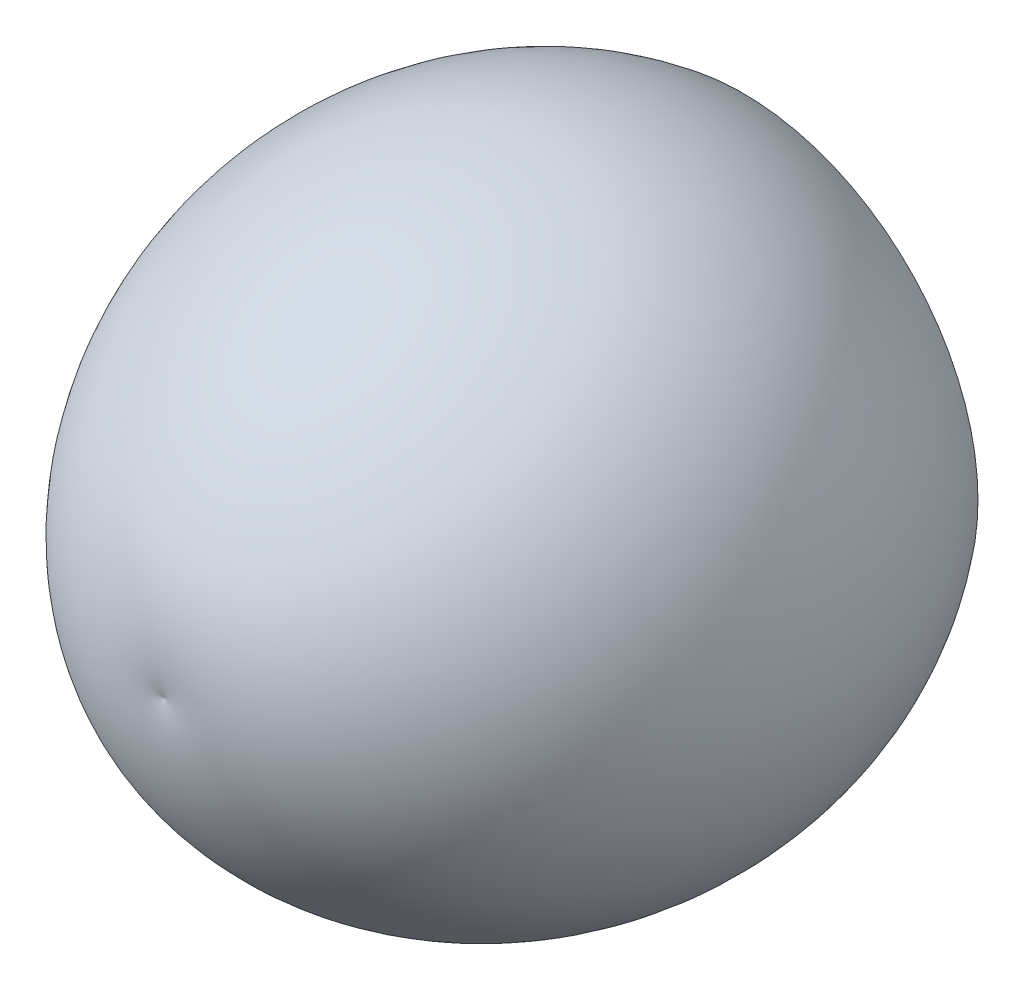
ISO-10303-21;
HEADER;
FILE_DESCRIPTION(('STEP AP214'),'2;1');
FILE_NAME('part.step','',(''),(''),'','','');
FILE_SCHEMA(('AUTOMOTIVE_DESIGN { 1 0 10303 214 1 1 1 1 }'));
ENDSEC;
DATA;
#1=APPLICATION_CONTEXT('core data for automotive mechanical design processes');
#2=APPLICATION_PROTOCOL_DEFINITION('international standard','automotive_design',2000,#1);
#3=PRODUCT_CONTEXT('',#1,'mechanical');
#4=PRODUCT('Part','Part','',(#3));
#5=PRODUCT_RELATED_PRODUCT_CATEGORY('part','',(#4));
#6=PRODUCT_DEFINITION_FORMATION('','',#4);
#7=PRODUCT_DEFINITION_CONTEXT('part definition',#1,'design');
#8=PRODUCT_DEFINITION('design','',#6,#7);
#9=PRODUCT_DEFINITION_SHAPE('','',#8);
#10=(LENGTH_UNIT() NAMED_UNIT(*) SI_UNIT(.MILLI.,.METRE.));
#11=(NAMED_UNIT(*) PLANE_ANGLE_UNIT() SI_UNIT($,.RADIAN.));
#12=(NAMED_UNIT(*) SI_UNIT($,.STERADIAN.) SOLID_ANGLE_UNIT());
#13=UNCERTAINTY_MEASURE_WITH_UNIT(LENGTH_MEASURE(1.E-05),#10,'distance_accuracy_value','');
#14=(GEOMETRIC_REPRESENTATION_CONTEXT(3) GLOBAL_UNCERTAINTY_ASSIGNED_CONTEXT((#13)) GLOBAL_UNIT_ASSIGNED_CONTEXT((#10,
#11,#12)) REPRESENTATION_CONTEXT('',''));
#15=CARTESIAN_POINT('',(0.,0.,0.));
#16=DIRECTION('',(0.,0.,1.));
#17=DIRECTION('',(1.,0.,0.));
#18=AXIS2_PLACEMENT_3D('',#15,#16,#17);
#19=CARTESIAN_POINT('',(0.,0.,0.));
#20=CARTESIAN_POINT('',(0.043830976130994,0.,0.0186791363310697));
#21=CARTESIAN_POINT('',(0.131974543979919,0.,0.0548378624464019));
#22=CARTESIAN_POINT('',(0.31022763523346,0.,0.122268555270368));
#23=CARTESIAN_POINT('',(0.670407337037751,0.,0.246977058198205));
#24=CARTESIAN_POINT('',(1.17142801003007,0.,0.400964352623035));
#25=CARTESIAN_POINT('',(1.81561581344275,0.,0.574205655000247));
#26=CARTESIAN_POINT('',(2.75085990380028,0.,0.7924162138733));
#27=CARTESIAN_POINT('',(3.8882458320896,0.,1.0127469204612));
#28=CARTESIAN_POINT('',(5.22919551712919,0.,1.21839888894545));
#29=CARTESIAN_POINT('',(6.77394931813752,0.,1.39284942327746));
#30=CARTESIAN_POINT('',(8.72532477994025,0.,1.54457831731911));
#31=CARTESIAN_POINT('',(11.0842847706564,0.,1.6281822498997));
#32=CARTESIAN_POINT('',(13.6441193424084,0.,1.60015484439841));
#33=CARTESIAN_POINT('',(16.398680633937,0.,1.44637657097625));
#34=CARTESIAN_POINT('',(19.5281539189791,0.,1.1548953203217));
#35=CARTESIAN_POINT('',(23.0243882545599,0.,0.682393983639629));
#36=CARTESIAN_POINT('',(27.0730604900188,0.,-0.0615872578854551));
#37=CARTESIAN_POINT('',(32.7936771558061,0.,-1.4223647519291));
#38=CARTESIAN_POINT('',(39.5430024310636,0.,-3.49089860816371));
#39=CARTESIAN_POINT('',(47.2245291139392,0.,-6.46735147429374));
#40=CARTESIAN_POINT('',(57.5562927937646,0.,-11.4363848691124));
#41=CARTESIAN_POINT('',(69.4027369692584,0.,-18.5710285506906));
#42=CARTESIAN_POINT('',(82.2967202987623,0.,-28.3725054942802));
#43=CARTESIAN_POINT('',(95.6199182335728,0.,-41.2795774666161));
#44=CARTESIAN_POINT('',(107.563224066596,0.,-55.8609472479338));
#45=CARTESIAN_POINT('',(117.827965423516,0.,-71.6658797242835));
#46=CARTESIAN_POINT('',(126.341324726231,0.,-88.4773133468858));
#47=CARTESIAN_POINT('',(133.036982051647,0.,-106.090936874956));
#48=CARTESIAN_POINT('',(137.252240905113,0.,-122.030733415426));
#49=CARTESIAN_POINT('',(139.657409359358,0.,-135.946181249383));
#50=CARTESIAN_POINT('',(140.841675986377,0.,-147.647372298136));
#51=CARTESIAN_POINT('',(141.291720366522,0.,-157.045426617269));
#52=CARTESIAN_POINT('',(141.233130837806,0.,-167.630271044416));
#53=CARTESIAN_POINT('',(140.42987636832,0.,-179.367359109796));
#54=CARTESIAN_POINT('',(138.941593194893,0.,-189.854188373775));
#55=CARTESIAN_POINT('',(137.020196404185,0.,-199.065653138572));
#56=CARTESIAN_POINT('',(135.258491664991,0.,-205.896350548171));
#57=CARTESIAN_POINT('',(133.955832387977,0.,-210.415164030316));
#58=CARTESIAN_POINT('',(132.5251616505,0.,-214.895091140581));
#59=CARTESIAN_POINT('',(130.966717722194,0.,-219.332220248478));
#60=CARTESIAN_POINT('',(129.280902335316,0.,-223.722506087244));
#61=CARTESIAN_POINT('',(127.69471036426,0.,-227.519557360189));
#62=CARTESIAN_POINT('',(126.256215149428,0.,-230.739744237555));
#63=CARTESIAN_POINT('',(124.754699009714,0.,-233.931037787412));
#64=CARTESIAN_POINT('',(123.451366323489,0.,-236.565139378214));
#65=CARTESIAN_POINT('',(122.095661560921,0.,-239.173327922019));
#66=CARTESIAN_POINT('',(120.407390083382,0.,-242.269136840017));
#67=CARTESIAN_POINT('',(118.656323389429,0.,-245.331912569755));
#68=CARTESIAN_POINT('',(116.830397080705,0.,-248.347471588187));
#69=CARTESIAN_POINT('',(114.925598842458,0.,-251.319153061921));
#70=CARTESIAN_POINT('',(113.292165698358,0.,-253.757347639572));
#71=CARTESIAN_POINT('',(112.115819327361,0.,-255.454750297579));
#72=CARTESIAN_POINT('',(111.101943834626,0.,-256.880227693953));
#73=CARTESIAN_POINT('',(110.202837030668,0.,-258.114214128868));
#74=CARTESIAN_POINT('',(109.493385846108,0.,-259.075677100228));
#75=CARTESIAN_POINT('',(108.670260494782,0.,-260.164838088381));
#76=CARTESIAN_POINT('',(107.969459905131,0.,-261.083221772819));
#77=CARTESIAN_POINT('',(107.245854497313,0.,-262.007379494795));
#78=CARTESIAN_POINT('',(106.881328516675,0.,-262.469058983019));
#79=CARTESIAN_POINT('',(106.696233767227,0.,-262.701929072325));
#80=B_SPLINE_CURVE_WITH_KNOTS('',4,(#19,#20,#21,#22,#23,#24,#25,#26,#27,#28,#29,#30,#31,#32,#33,
#34,#35,#36,#37,#38,#39,#40,#41,#42,#43,#44,#45,#46,#47,#48,#49,#50,#51,#52,#53,#54,#55,#56,#57,
#58,#59,#60,#61,#62,#63,#64,#65,#66,#67,#68,#69,#70,#71,#72,#73,#74,#75,#76,#77,#78,#79),
.UNSPECIFIED.,.F.,.F.,(5,1,1,1,1,1,1,1,1,1,1,1,1,1,1,1,1,1,1,1,1,1,1,1,1,1,1,1,1,1,1,1,1,1,1,1,
1,1,1,1,1,1,1,1,1,1,1,1,1,1,1,1,1,1,1,1,1,5),(0.,0.000496676085382172,0.000993352170764345,
0.00198670434152869,0.00397340868305738,0.00596011302458607,0.00794681736611476,
0.0119979252521332,0.0160490331381516,0.02010014102417,0.0241512489101885,0.0324007889414404,
0.0406503289726922,0.046778870002393,0.0529074110320937,0.0651644930914951,0.0774205810890931,
0.0896766690866912,0.114189811680301,0.138702404650163,0.163215230713746,0.209093251875566,
0.258118854313432,0.307144114402691,0.356169607835554,0.405195108308226,0.454220504059607,
0.503245934244853,0.552271367805309,0.576784105575738,0.601296843346166,0.625809560474281,
0.650322277602395,0.687091361319528,0.723860440566191,0.736116799570001,0.74837315857381,
0.760629519262714,0.772885879951618,0.785142240640521,0.797398601329425,0.809654959802713,
0.815783139039357,0.821911318276001,0.834167676749288,0.840295855985932,0.846424035222576,
0.858680391039599,0.870936746856622,0.877064924765134,0.883193102673645,0.889321280582157,
0.892385369536413,0.895449458490668,0.898861033442164,0.902272608393659,0.905684183345154,
0.90909575829665),.UNSPECIFIED.);
#81=CARTESIAN_POINT('',(3.40249342327014E-12,0.,737.298070927678));
#82=DIRECTION('',(0.,0.,1.));
#83=AXIS1_PLACEMENT('',#81,#82);
#84=SURFACE_OF_REVOLUTION('',#80,#83);
#85=CARTESIAN_POINT('',(0.,0.,-262.701929072321));
#86=DIRECTION('',(0.,0.,1.));
#87=DIRECTION('',(1.,0.,0.));
#88=AXIS2_PLACEMENT_3D('',#85,#86,#87);
#89=CIRCLE('',#88,106.696233767229);
#90=CARTESIAN_POINT('',(106.696233767229,0.,-262.701929072322));
#91=VERTEX_POINT('',#90);
#92=EDGE_CURVE('E11',#91,#91,#89,.T.);
#93=ORIENTED_EDGE('',*,*,#92,.T.);
#94=EDGE_LOOP('',(#93));
#95=FACE_BOUND('',#94,.T.);
#96=CARTESIAN_POINT('',(0.,0.,0.));
#97=VERTEX_POINT('',#96);
#98=VERTEX_LOOP('',#97);
#99=FACE_BOUND('',#98,.T.);
#100=ADVANCED_FACE('F43',(#95,#99),#84,.F.);
#101=CARTESIAN_POINT('',(106.696233767229,0.,-262.701929072322));
#102=DIRECTION('',(0.,0.,-1.));
#103=DIRECTION('',(-1.,0.,0.));
#104=AXIS2_PLACEMENT_3D('',#101,#102,#103);
#105=PLANE('',#104);
#106=CARTESIAN_POINT('',(-9.01133029205691E-13,0.,-262.701929072321));
#107=DIRECTION('',(0.,0.,-1.));
#108=DIRECTION('',(-1.,0.,0.));
#109=AXIS2_PLACEMENT_3D('',#106,#107,#108);
#110=CIRCLE('',#109,80.);
#111=CARTESIAN_POINT('',(-80.0000000000009,0.,-262.701929072321));
#112=VERTEX_POINT('',#111);
#113=EDGE_CURVE('E78',#112,#112,#110,.T.);
#114=ORIENTED_EDGE('',*,*,#113,.F.);
#115=EDGE_LOOP('',(#114));
#116=FACE_BOUND('',#115,.T.);
#117=ORIENTED_EDGE('',*,*,#92,.F.);
#118=EDGE_LOOP('',(#117));
#119=FACE_BOUND('',#118,.T.);
#120=ADVANCED_FACE('F54',(#116,#119),#105,.T.);
#121=CARTESIAN_POINT('',(-7.6392306925026E-13,0.,-222.701929072321));
#122=DIRECTION('',(0.,0.,-1.));
#123=DIRECTION('',(-1.,0.,0.));
#124=AXIS2_PLACEMENT_3D('',#121,#122,#123);
#125=CYLINDRICAL_SURFACE('',#124,80.);
#126=CARTESIAN_POINT('',(-7.6392306925026E-13,0.,-222.701929072321));
#127=DIRECTION('',(0.,0.,-1.));
#128=DIRECTION('',(-1.,0.,0.));
#129=AXIS2_PLACEMENT_3D('',#126,#127,#128);
#130=CIRCLE('',#129,80.);
#131=CARTESIAN_POINT('',(-80.0000000000008,0.,-222.701929072321));
#132=VERTEX_POINT('',#131);
#133=EDGE_CURVE('E50',#132,#132,#130,.T.);
#134=ORIENTED_EDGE('',*,*,#133,.F.);
#135=EDGE_LOOP('',(#134));
#136=FACE_BOUND('',#135,.T.);
#137=ORIENTED_EDGE('',*,*,#113,.T.);
#138=EDGE_LOOP('',(#137));
#139=FACE_BOUND('',#138,.T.);
#140=ADVANCED_FACE('F59',(#136,#139),#125,.F.);
#141=CARTESIAN_POINT('',(-7.6392306925026E-13,0.,-222.701929072321));
#142=DIRECTION('',(0.,0.,-1.));
#143=DIRECTION('',(-1.,0.,0.));
#144=AXIS2_PLACEMENT_3D('',#141,#142,#143);
#145=PLANE('',#144);
#146=ORIENTED_EDGE('',*,*,#133,.T.);
#147=EDGE_LOOP('',(#146));
#148=FACE_BOUND('',#147,.T.);
#149=ADVANCED_FACE('F66',(#148),#145,.T.);
#150=CLOSED_SHELL('',(#100,#120,#140,#149));
#151=MANIFOLD_SOLID_BREP('B2',#150);
#152=ADVANCED_BREP_SHAPE_REPRESENTATION('',(#18,#151),#14);
#153=SHAPE_DEFINITION_REPRESENTATION(#9,#152);
ENDSEC;
END-ISO-10303-21;
